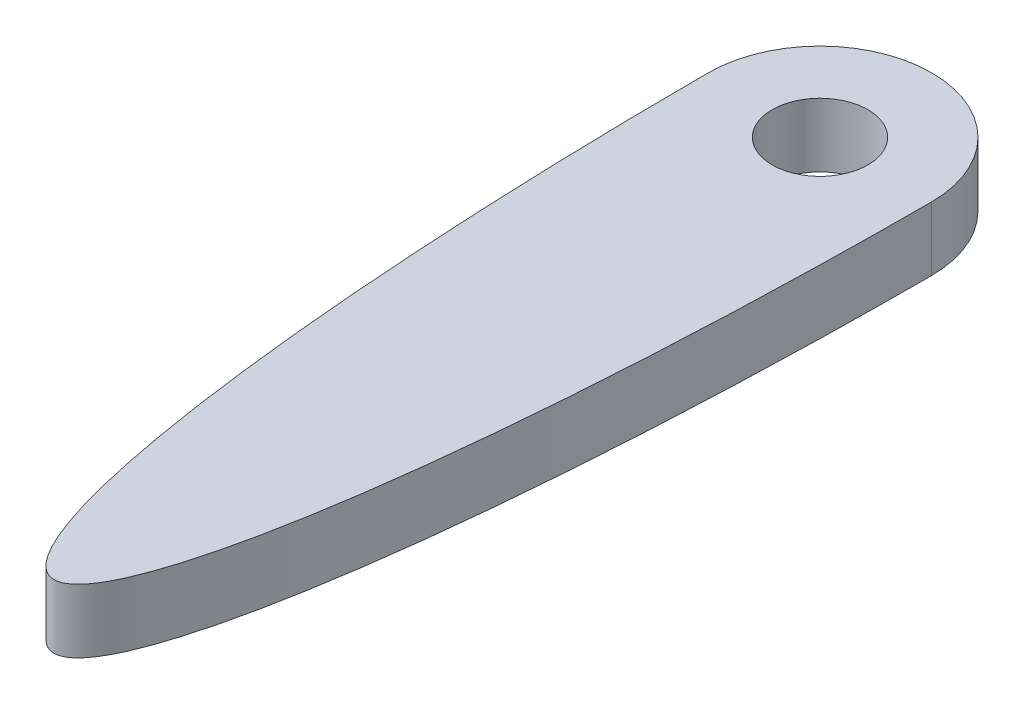
ISO-10303-21;
HEADER;
FILE_DESCRIPTION(('STEP AP214'),'2;1');
FILE_NAME('part.step','',(''),(''),'','','');
FILE_SCHEMA(('AUTOMOTIVE_DESIGN { 1 0 10303 214 1 1 1 1 }'));
ENDSEC;
DATA;
#1=APPLICATION_CONTEXT('core data for automotive mechanical design processes');
#2=APPLICATION_PROTOCOL_DEFINITION('international standard','automotive_design',2000,#1);
#3=PRODUCT_CONTEXT('',#1,'mechanical');
#4=PRODUCT('Part','Part','',(#3));
#5=PRODUCT_RELATED_PRODUCT_CATEGORY('part','',(#4));
#6=PRODUCT_DEFINITION_FORMATION('','',#4);
#7=PRODUCT_DEFINITION_CONTEXT('part definition',#1,'design');
#8=PRODUCT_DEFINITION('design','',#6,#7);
#9=PRODUCT_DEFINITION_SHAPE('','',#8);
#10=(LENGTH_UNIT() NAMED_UNIT(*) SI_UNIT(.MILLI.,.METRE.));
#11=(NAMED_UNIT(*) PLANE_ANGLE_UNIT() SI_UNIT($,.RADIAN.));
#12=(NAMED_UNIT(*) SI_UNIT($,.STERADIAN.) SOLID_ANGLE_UNIT());
#13=UNCERTAINTY_MEASURE_WITH_UNIT(LENGTH_MEASURE(1.E-05),#10,'distance_accuracy_value','');
#14=(GEOMETRIC_REPRESENTATION_CONTEXT(3) GLOBAL_UNCERTAINTY_ASSIGNED_CONTEXT((#13)) GLOBAL_UNIT_ASSIGNED_CONTEXT((#10,
#11,#12)) REPRESENTATION_CONTEXT('',''));
#15=CARTESIAN_POINT('',(0.,0.,0.));
#16=DIRECTION('',(0.,0.,1.));
#17=DIRECTION('',(1.,0.,0.));
#18=AXIS2_PLACEMENT_3D('',#15,#16,#17);
#19=CARTESIAN_POINT('',(0.,3.175,0.));
#20=DIRECTION('',(0.,1.,0.));
#21=DIRECTION('',(0.,0.,-1.));
#22=AXIS2_PLACEMENT_3D('',#19,#20,#21);
#23=ELLIPSE('',#22,38.1,5.55625);
#24=DIRECTION('',(0.,-1.,0.));
#25=VECTOR('',#24,1.);
#26=SURFACE_OF_LINEAR_EXTRUSION('',#23,#25);
#27=CARTESIAN_POINT('',(0.,0.,0.));
#28=DIRECTION('',(0.,1.,0.));
#29=DIRECTION('',(0.,0.,-1.));
#30=AXIS2_PLACEMENT_3D('',#27,#28,#29);
#31=ELLIPSE('',#30,38.1,5.55625);
#32=CARTESIAN_POINT('',(-5.55625,0.,0.));
#33=VERTEX_POINT('',#32);
#34=CARTESIAN_POINT('',(5.55625,0.,0.));
#35=VERTEX_POINT('',#34);
#36=EDGE_CURVE('E75',#33,#35,#31,.T.);
#37=ORIENTED_EDGE('',*,*,#36,.T.);
#38=DIRECTION('',(0.,-1.,0.));
#39=VECTOR('',#38,1.);
#40=CARTESIAN_POINT('',(5.55625,3.175,0.));
#41=LINE('',#40,#39);
#42=CARTESIAN_POINT('',(5.55625,3.175,0.));
#43=VERTEX_POINT('',#42);
#44=EDGE_CURVE('E11',#43,#35,#41,.T.);
#45=ORIENTED_EDGE('',*,*,#44,.F.);
#46=CARTESIAN_POINT('',(-5.55625,3.175,0.));
#47=VERTEX_POINT('',#46);
#48=EDGE_CURVE('E78',#47,#43,#23,.T.);
#49=ORIENTED_EDGE('',*,*,#48,.F.);
#50=DIRECTION('',(0.,-1.,0.));
#51=VECTOR('',#50,1.);
#52=CARTESIAN_POINT('',(-5.55625,3.175,0.));
#53=LINE('',#52,#51);
#54=EDGE_CURVE('E51',#47,#33,#53,.T.);
#55=ORIENTED_EDGE('',*,*,#54,.T.);
#56=EDGE_LOOP('',(#37,#45,#49,#55));
#57=FACE_BOUND('',#56,.T.);
#58=ADVANCED_FACE('F41',(#57),#26,.F.);
#59=CARTESIAN_POINT('',(0.,3.175,0.));
#60=DIRECTION('',(0.,-1.,0.));
#61=DIRECTION('',(0.,0.,-1.));
#62=AXIS2_PLACEMENT_3D('',#59,#60,#61);
#63=CYLINDRICAL_SURFACE('',#62,5.55625);
#64=CARTESIAN_POINT('',(0.,0.,0.));
#65=DIRECTION('',(0.,1.,0.));
#66=DIRECTION('',(0.,0.,1.));
#67=AXIS2_PLACEMENT_3D('',#64,#65,#66);
#68=CIRCLE('',#67,5.55625);
#69=EDGE_CURVE('E66',#35,#33,#68,.T.);
#70=ORIENTED_EDGE('',*,*,#69,.T.);
#71=ORIENTED_EDGE('',*,*,#54,.F.);
#72=CARTESIAN_POINT('',(0.,3.175,0.));
#73=DIRECTION('',(0.,1.,0.));
#74=DIRECTION('',(0.,0.,1.));
#75=AXIS2_PLACEMENT_3D('',#72,#73,#74);
#76=CIRCLE('',#75,5.55625);
#77=EDGE_CURVE('E58',#43,#47,#76,.T.);
#78=ORIENTED_EDGE('',*,*,#77,.F.);
#79=ORIENTED_EDGE('',*,*,#44,.T.);
#80=EDGE_LOOP('',(#70,#71,#78,#79));
#81=FACE_BOUND('',#80,.T.);
#82=ADVANCED_FACE('F69',(#81),#63,.T.);
#83=CARTESIAN_POINT('',(0.,3.175,0.));
#84=DIRECTION('',(0.,-1.,0.));
#85=DIRECTION('',(0.,0.,-1.));
#86=AXIS2_PLACEMENT_3D('',#83,#84,#85);
#87=CYLINDRICAL_SURFACE('',#86,2.38125);
#88=CARTESIAN_POINT('',(0.,3.175,0.));
#89=DIRECTION('',(0.,1.,0.));
#90=DIRECTION('',(0.,0.,1.));
#91=AXIS2_PLACEMENT_3D('',#88,#89,#90);
#92=CIRCLE('',#91,2.38125);
#93=CARTESIAN_POINT('',(0.,3.175,2.38125));
#94=VERTEX_POINT('',#93);
#95=EDGE_CURVE('E80',#94,#94,#92,.T.);
#96=ORIENTED_EDGE('',*,*,#95,.T.);
#97=EDGE_LOOP('',(#96));
#98=FACE_BOUND('',#97,.T.);
#99=CARTESIAN_POINT('',(0.,0.,0.));
#100=DIRECTION('',(0.,1.,0.));
#101=DIRECTION('',(0.,0.,1.));
#102=AXIS2_PLACEMENT_3D('',#99,#100,#101);
#103=CIRCLE('',#102,2.38125);
#104=CARTESIAN_POINT('',(0.,0.,2.38125));
#105=VERTEX_POINT('',#104);
#106=EDGE_CURVE('E74',#105,#105,#103,.T.);
#107=ORIENTED_EDGE('',*,*,#106,.F.);
#108=EDGE_LOOP('',(#107));
#109=FACE_BOUND('',#108,.T.);
#110=ADVANCED_FACE('F98',(#98,#109),#87,.F.);
#111=CARTESIAN_POINT('',(0.,3.175,0.));
#112=DIRECTION('',(0.,1.,0.));
#113=DIRECTION('',(0.,0.,1.));
#114=AXIS2_PLACEMENT_3D('',#111,#112,#113);
#115=PLANE('',#114);
#116=ORIENTED_EDGE('',*,*,#48,.T.);
#117=ORIENTED_EDGE('',*,*,#77,.T.);
#118=EDGE_LOOP('',(#116,#117));
#119=FACE_BOUND('',#118,.T.);
#120=ORIENTED_EDGE('',*,*,#95,.F.);
#121=EDGE_LOOP('',(#120));
#122=FACE_BOUND('',#121,.T.);
#123=ADVANCED_FACE('F101',(#119,#122),#115,.T.);
#124=CARTESIAN_POINT('',(0.,0.,0.));
#125=DIRECTION('',(0.,1.,0.));
#126=DIRECTION('',(0.,0.,1.));
#127=AXIS2_PLACEMENT_3D('',#124,#125,#126);
#128=PLANE('',#127);
#129=ORIENTED_EDGE('',*,*,#36,.F.);
#130=ORIENTED_EDGE('',*,*,#69,.F.);
#131=EDGE_LOOP('',(#129,#130));
#132=FACE_BOUND('',#131,.T.);
#133=ORIENTED_EDGE('',*,*,#106,.T.);
#134=EDGE_LOOP('',(#133));
#135=FACE_BOUND('',#134,.T.);
#136=ADVANCED_FACE('F81',(#132,#135),#128,.F.);
#137=CLOSED_SHELL('',(#58,#82,#110,#123,#136));
#138=MANIFOLD_SOLID_BREP('B2',#137);
#139=ADVANCED_BREP_SHAPE_REPRESENTATION('',(#18,#138),#14);
#140=SHAPE_DEFINITION_REPRESENTATION(#9,#139);
ENDSEC;
END-ISO-10303-21;
